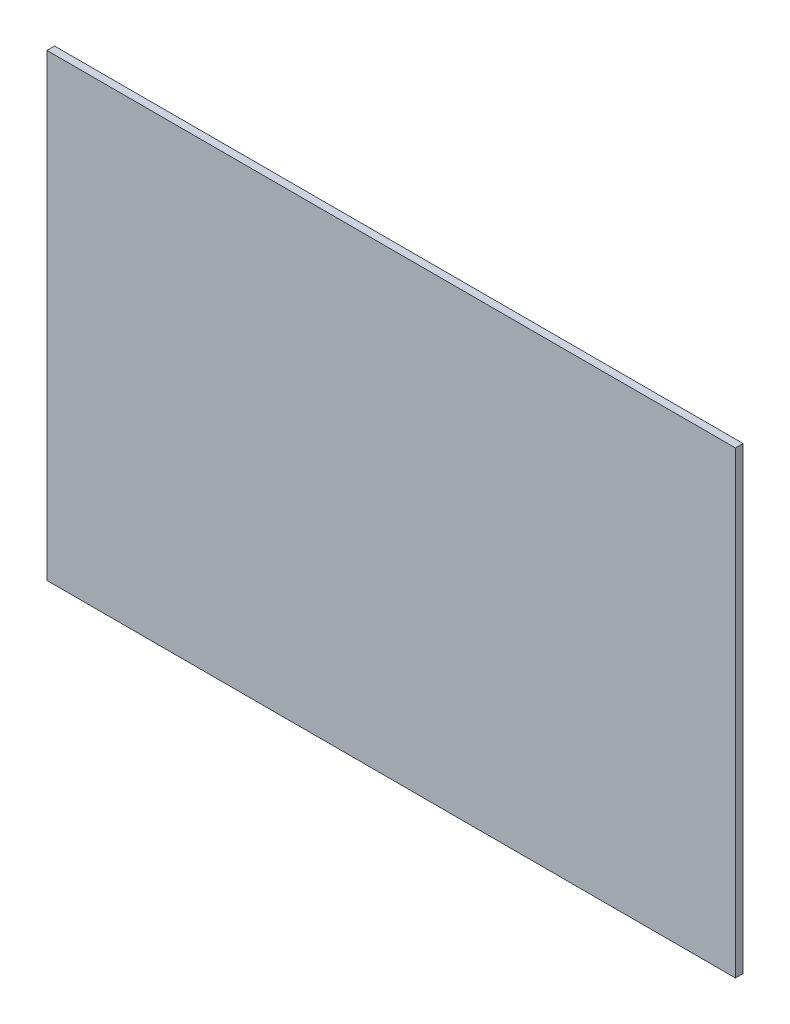
ISO-10303-21;
HEADER;
FILE_DESCRIPTION(('STEP AP214'),'2;1');
FILE_NAME('part.step','',(''),(''),'','','');
FILE_SCHEMA(('AUTOMOTIVE_DESIGN { 1 0 10303 214 1 1 1 1 }'));
ENDSEC;
DATA;
#1=APPLICATION_CONTEXT('core data for automotive mechanical design processes');
#2=APPLICATION_PROTOCOL_DEFINITION('international standard','automotive_design',2000,#1);
#3=PRODUCT_CONTEXT('',#1,'mechanical');
#4=PRODUCT('Part','Part','',(#3));
#5=PRODUCT_RELATED_PRODUCT_CATEGORY('part','',(#4));
#6=PRODUCT_DEFINITION_FORMATION('','',#4);
#7=PRODUCT_DEFINITION_CONTEXT('part definition',#1,'design');
#8=PRODUCT_DEFINITION('design','',#6,#7);
#9=PRODUCT_DEFINITION_SHAPE('','',#8);
#10=(LENGTH_UNIT() NAMED_UNIT(*) SI_UNIT(.MILLI.,.METRE.));
#11=(NAMED_UNIT(*) PLANE_ANGLE_UNIT() SI_UNIT($,.RADIAN.));
#12=(NAMED_UNIT(*) SI_UNIT($,.STERADIAN.) SOLID_ANGLE_UNIT());
#13=UNCERTAINTY_MEASURE_WITH_UNIT(LENGTH_MEASURE(1.E-05),#10,'distance_accuracy_value','');
#14=(GEOMETRIC_REPRESENTATION_CONTEXT(3) GLOBAL_UNCERTAINTY_ASSIGNED_CONTEXT((#13)) GLOBAL_UNIT_ASSIGNED_CONTEXT((#10,
#11,#12)) REPRESENTATION_CONTEXT('',''));
#15=CARTESIAN_POINT('',(0.,0.,0.));
#16=DIRECTION('',(0.,0.,1.));
#17=DIRECTION('',(1.,0.,0.));
#18=AXIS2_PLACEMENT_3D('',#15,#16,#17);
#19=CARTESIAN_POINT('',(-225.,150.,5.));
#20=DIRECTION('',(1.,0.,0.));
#21=DIRECTION('',(0.,1.,0.));
#22=AXIS2_PLACEMENT_3D('',#19,#20,#21);
#23=PLANE('',#22);
#24=DIRECTION('',(0.,-1.,0.));
#25=VECTOR('',#24,1.);
#26=CARTESIAN_POINT('',(-225.,150.,0.));
#27=LINE('',#26,#25);
#28=CARTESIAN_POINT('',(-225.,150.,0.));
#29=VERTEX_POINT('',#28);
#30=CARTESIAN_POINT('',(-225.,-150.,0.));
#31=VERTEX_POINT('',#30);
#32=EDGE_CURVE('E96',#29,#31,#27,.T.);
#33=ORIENTED_EDGE('',*,*,#32,.T.);
#34=DIRECTION('',(0.,0.,-1.));
#35=VECTOR('',#34,1.);
#36=CARTESIAN_POINT('',(-225.,-150.,5.));
#37=LINE('',#36,#35);
#38=CARTESIAN_POINT('',(-225.,-150.,5.));
#39=VERTEX_POINT('',#38);
#40=EDGE_CURVE('E11',#39,#31,#37,.T.);
#41=ORIENTED_EDGE('',*,*,#40,.F.);
#42=DIRECTION('',(0.,-1.,0.));
#43=VECTOR('',#42,1.);
#44=CARTESIAN_POINT('',(-225.,150.,5.));
#45=LINE('',#44,#43);
#46=CARTESIAN_POINT('',(-225.,150.,5.));
#47=VERTEX_POINT('',#46);
#48=EDGE_CURVE('E84',#47,#39,#45,.T.);
#49=ORIENTED_EDGE('',*,*,#48,.F.);
#50=DIRECTION('',(0.,0.,-1.));
#51=VECTOR('',#50,1.);
#52=CARTESIAN_POINT('',(-225.,150.,5.));
#53=LINE('',#52,#51);
#54=EDGE_CURVE('E92',#47,#29,#53,.T.);
#55=ORIENTED_EDGE('',*,*,#54,.T.);
#56=EDGE_LOOP('',(#33,#41,#49,#55));
#57=FACE_BOUND('',#56,.T.);
#58=ADVANCED_FACE('F33',(#57),#23,.F.);
#59=CARTESIAN_POINT('',(225.,-150.,5.));
#60=DIRECTION('',(0.,1.,0.));
#61=DIRECTION('',(-1.,0.,0.));
#62=AXIS2_PLACEMENT_3D('',#59,#60,#61);
#63=PLANE('',#62);
#64=DIRECTION('',(1.,0.,0.));
#65=VECTOR('',#64,1.);
#66=CARTESIAN_POINT('',(225.,-150.,0.));
#67=LINE('',#66,#65);
#68=CARTESIAN_POINT('',(225.,-150.,0.));
#69=VERTEX_POINT('',#68);
#70=EDGE_CURVE('E88',#31,#69,#67,.T.);
#71=ORIENTED_EDGE('',*,*,#70,.T.);
#72=DIRECTION('',(0.,0.,-1.));
#73=VECTOR('',#72,1.);
#74=CARTESIAN_POINT('',(225.,-150.,5.));
#75=LINE('',#74,#73);
#76=CARTESIAN_POINT('',(225.,-150.,5.));
#77=VERTEX_POINT('',#76);
#78=EDGE_CURVE('E41',#77,#69,#75,.T.);
#79=ORIENTED_EDGE('',*,*,#78,.F.);
#80=DIRECTION('',(1.,0.,0.));
#81=VECTOR('',#80,1.);
#82=CARTESIAN_POINT('',(225.,-150.,5.));
#83=LINE('',#82,#81);
#84=EDGE_CURVE('E79',#39,#77,#83,.T.);
#85=ORIENTED_EDGE('',*,*,#84,.F.);
#86=ORIENTED_EDGE('',*,*,#40,.T.);
#87=EDGE_LOOP('',(#71,#79,#85,#86));
#88=FACE_BOUND('',#87,.T.);
#89=ADVANCED_FACE('F87',(#88),#63,.F.);
#90=CARTESIAN_POINT('',(225.,150.,5.));
#91=DIRECTION('',(-1.,0.,0.));
#92=DIRECTION('',(0.,0.,1.));
#93=AXIS2_PLACEMENT_3D('',#90,#91,#92);
#94=PLANE('',#93);
#95=DIRECTION('',(0.,1.,0.));
#96=VECTOR('',#95,1.);
#97=CARTESIAN_POINT('',(225.,150.,0.));
#98=LINE('',#97,#96);
#99=CARTESIAN_POINT('',(225.,150.,0.));
#100=VERTEX_POINT('',#99);
#101=EDGE_CURVE('E66',#69,#100,#98,.T.);
#102=ORIENTED_EDGE('',*,*,#101,.T.);
#103=DIRECTION('',(0.,0.,-1.));
#104=VECTOR('',#103,1.);
#105=CARTESIAN_POINT('',(225.,150.,5.));
#106=LINE('',#105,#104);
#107=CARTESIAN_POINT('',(225.,150.,5.));
#108=VERTEX_POINT('',#107);
#109=EDGE_CURVE('E89',#108,#100,#106,.T.);
#110=ORIENTED_EDGE('',*,*,#109,.F.);
#111=DIRECTION('',(0.,1.,0.));
#112=VECTOR('',#111,1.);
#113=CARTESIAN_POINT('',(225.,150.,5.));
#114=LINE('',#113,#112);
#115=EDGE_CURVE('E82',#77,#108,#114,.T.);
#116=ORIENTED_EDGE('',*,*,#115,.F.);
#117=ORIENTED_EDGE('',*,*,#78,.T.);
#118=EDGE_LOOP('',(#102,#110,#116,#117));
#119=FACE_BOUND('',#118,.T.);
#120=ADVANCED_FACE('F90',(#119),#94,.F.);
#121=CARTESIAN_POINT('',(225.,150.,5.));
#122=DIRECTION('',(0.,-1.,0.));
#123=DIRECTION('',(1.,0.,0.));
#124=AXIS2_PLACEMENT_3D('',#121,#122,#123);
#125=PLANE('',#124);
#126=DIRECTION('',(-1.,0.,0.));
#127=VECTOR('',#126,1.);
#128=CARTESIAN_POINT('',(225.,150.,0.));
#129=LINE('',#128,#127);
#130=EDGE_CURVE('E72',#100,#29,#129,.T.);
#131=ORIENTED_EDGE('',*,*,#130,.T.);
#132=ORIENTED_EDGE('',*,*,#54,.F.);
#133=DIRECTION('',(-1.,0.,0.));
#134=VECTOR('',#133,1.);
#135=CARTESIAN_POINT('',(225.,150.,5.));
#136=LINE('',#135,#134);
#137=EDGE_CURVE('E49',#108,#47,#136,.T.);
#138=ORIENTED_EDGE('',*,*,#137,.F.);
#139=ORIENTED_EDGE('',*,*,#109,.T.);
#140=EDGE_LOOP('',(#131,#132,#138,#139));
#141=FACE_BOUND('',#140,.T.);
#142=ADVANCED_FACE('F103',(#141),#125,.F.);
#143=CARTESIAN_POINT('',(0.,0.,5.));
#144=DIRECTION('',(0.,0.,-1.));
#145=DIRECTION('',(-1.,0.,0.));
#146=AXIS2_PLACEMENT_3D('',#143,#144,#145);
#147=PLANE('',#146);
#148=ORIENTED_EDGE('',*,*,#48,.T.);
#149=ORIENTED_EDGE('',*,*,#84,.T.);
#150=ORIENTED_EDGE('',*,*,#115,.T.);
#151=ORIENTED_EDGE('',*,*,#137,.T.);
#152=EDGE_LOOP('',(#148,#149,#150,#151));
#153=FACE_BOUND('',#152,.T.);
#154=ADVANCED_FACE('F80',(#153),#147,.F.);
#155=CARTESIAN_POINT('',(0.,0.,0.));
#156=DIRECTION('',(0.,0.,-1.));
#157=DIRECTION('',(-1.,0.,0.));
#158=AXIS2_PLACEMENT_3D('',#155,#156,#157);
#159=PLANE('',#158);
#160=ORIENTED_EDGE('',*,*,#32,.F.);
#161=ORIENTED_EDGE('',*,*,#130,.F.);
#162=ORIENTED_EDGE('',*,*,#101,.F.);
#163=ORIENTED_EDGE('',*,*,#70,.F.);
#164=EDGE_LOOP('',(#160,#161,#162,#163));
#165=FACE_BOUND('',#164,.T.);
#166=ADVANCED_FACE('F106',(#165),#159,.T.);
#167=CLOSED_SHELL('',(#58,#89,#120,#142,#154,#166));
#168=MANIFOLD_SOLID_BREP('B2',#167);
#169=ADVANCED_BREP_SHAPE_REPRESENTATION('',(#18,#168),#14);
#170=SHAPE_DEFINITION_REPRESENTATION(#9,#169);
ENDSEC;
END-ISO-10303-21;
